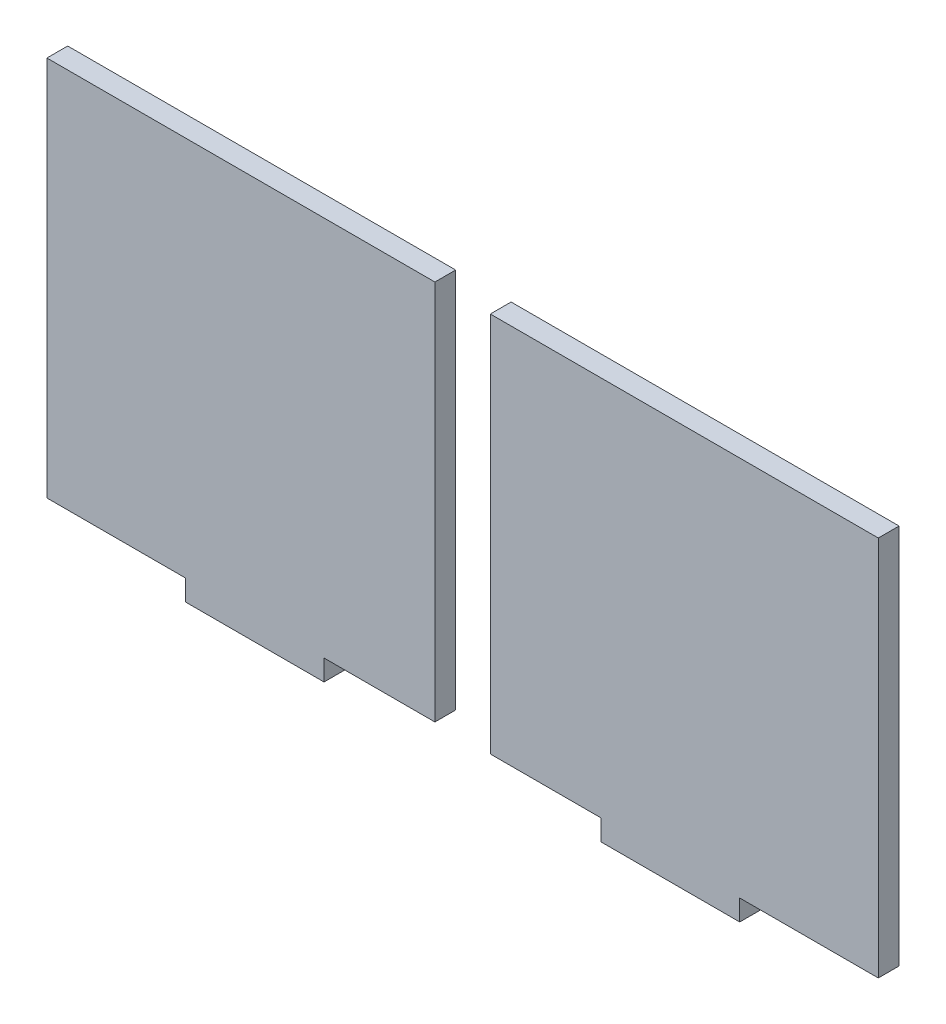
ISO-10303-21;
HEADER;
FILE_DESCRIPTION(('STEP AP214'),'2;1');
FILE_NAME('part.step','',(''),(''),'','','');
FILE_SCHEMA(('AUTOMOTIVE_DESIGN { 1 0 10303 214 1 1 1 1 }'));
ENDSEC;
DATA;
#1=APPLICATION_CONTEXT('core data for automotive mechanical design processes');
#2=APPLICATION_PROTOCOL_DEFINITION('international standard','automotive_design',2000,#1);
#3=PRODUCT_CONTEXT('',#1,'mechanical');
#4=PRODUCT('Part','Part','',(#3));
#5=PRODUCT_RELATED_PRODUCT_CATEGORY('part','',(#4));
#6=PRODUCT_DEFINITION_FORMATION('','',#4);
#7=PRODUCT_DEFINITION_CONTEXT('part definition',#1,'design');
#8=PRODUCT_DEFINITION('design','',#6,#7);
#9=PRODUCT_DEFINITION_SHAPE('','',#8);
#10=(LENGTH_UNIT() NAMED_UNIT(*) SI_UNIT(.MILLI.,.METRE.));
#11=(NAMED_UNIT(*) PLANE_ANGLE_UNIT() SI_UNIT($,.RADIAN.));
#12=(NAMED_UNIT(*) SI_UNIT($,.STERADIAN.) SOLID_ANGLE_UNIT());
#13=UNCERTAINTY_MEASURE_WITH_UNIT(LENGTH_MEASURE(1.E-05),#10,'distance_accuracy_value','');
#14=(GEOMETRIC_REPRESENTATION_CONTEXT(3) GLOBAL_UNCERTAINTY_ASSIGNED_CONTEXT((#13)) GLOBAL_UNIT_ASSIGNED_CONTEXT((#10,
#11,#12)) REPRESENTATION_CONTEXT('',''));
#15=CARTESIAN_POINT('',(0.,0.,0.));
#16=DIRECTION('',(0.,0.,1.));
#17=DIRECTION('',(1.,0.,0.));
#18=AXIS2_PLACEMENT_3D('',#15,#16,#17);
#19=CARTESIAN_POINT('',(120.,0.,-3.));
#20=DIRECTION('',(0.,-1.,0.));
#21=DIRECTION('',(1.,0.,0.));
#22=AXIS2_PLACEMENT_3D('',#19,#20,#21);
#23=PLANE('',#22);
#24=DIRECTION('',(1.,0.,0.));
#25=VECTOR('',#24,1.);
#26=CARTESIAN_POINT('',(120.,0.,-3.));
#27=LINE('',#26,#25);
#28=CARTESIAN_POINT('',(64.,0.,-3.));
#29=VERTEX_POINT('',#28);
#30=CARTESIAN_POINT('',(80.,0.,-3.));
#31=VERTEX_POINT('',#30);
#32=EDGE_CURVE('E162',#29,#31,#27,.T.);
#33=ORIENTED_EDGE('',*,*,#32,.T.);
#34=DIRECTION('',(0.,0.,1.));
#35=VECTOR('',#34,1.);
#36=CARTESIAN_POINT('',(80.,0.,-3.));
#37=LINE('',#36,#35);
#38=CARTESIAN_POINT('',(80.,0.,0.));
#39=VERTEX_POINT('',#38);
#40=EDGE_CURVE('E140',#31,#39,#37,.T.);
#41=ORIENTED_EDGE('',*,*,#40,.T.);
#42=DIRECTION('',(1.,0.,0.));
#43=VECTOR('',#42,1.);
#44=CARTESIAN_POINT('',(120.,0.,0.));
#45=LINE('',#44,#43);
#46=CARTESIAN_POINT('',(64.,0.,0.));
#47=VERTEX_POINT('',#46);
#48=EDGE_CURVE('E157',#47,#39,#45,.T.);
#49=ORIENTED_EDGE('',*,*,#48,.F.);
#50=DIRECTION('',(0.,0.,1.));
#51=VECTOR('',#50,1.);
#52=CARTESIAN_POINT('',(64.,0.,-3.));
#53=LINE('',#52,#51);
#54=EDGE_CURVE('E52',#29,#47,#53,.T.);
#55=ORIENTED_EDGE('',*,*,#54,.F.);
#56=EDGE_LOOP('',(#33,#41,#49,#55));
#57=FACE_BOUND('',#56,.T.);
#58=ADVANCED_FACE('F43',(#57),#23,.T.);
#59=CARTESIAN_POINT('',(120.,55.,-3.));
#60=DIRECTION('',(1.,0.,0.));
#61=DIRECTION('',(0.,0.,-1.));
#62=AXIS2_PLACEMENT_3D('',#59,#60,#61);
#63=PLANE('',#62);
#64=DIRECTION('',(0.,1.,0.));
#65=VECTOR('',#64,1.);
#66=CARTESIAN_POINT('',(120.,55.,0.));
#67=LINE('',#66,#65);
#68=CARTESIAN_POINT('',(120.,0.,0.));
#69=VERTEX_POINT('',#68);
#70=CARTESIAN_POINT('',(120.,55.,0.));
#71=VERTEX_POINT('',#70);
#72=EDGE_CURVE('E149',#69,#71,#67,.T.);
#73=ORIENTED_EDGE('',*,*,#72,.F.);
#74=DIRECTION('',(0.,0.,1.));
#75=VECTOR('',#74,1.);
#76=CARTESIAN_POINT('',(120.,0.,-3.));
#77=LINE('',#76,#75);
#78=CARTESIAN_POINT('',(120.,0.,-3.));
#79=VERTEX_POINT('',#78);
#80=EDGE_CURVE('E12',#79,#69,#77,.T.);
#81=ORIENTED_EDGE('',*,*,#80,.F.);
#82=DIRECTION('',(0.,1.,0.));
#83=VECTOR('',#82,1.);
#84=CARTESIAN_POINT('',(120.,55.,-3.));
#85=LINE('',#84,#83);
#86=CARTESIAN_POINT('',(120.,55.,-3.));
#87=VERTEX_POINT('',#86);
#88=EDGE_CURVE('E153',#79,#87,#85,.T.);
#89=ORIENTED_EDGE('',*,*,#88,.T.);
#90=DIRECTION('',(0.,0.,1.));
#91=VECTOR('',#90,1.);
#92=CARTESIAN_POINT('',(120.,55.,-3.));
#93=LINE('',#92,#91);
#94=EDGE_CURVE('E47',#87,#71,#93,.T.);
#95=ORIENTED_EDGE('',*,*,#94,.T.);
#96=EDGE_LOOP('',(#73,#81,#89,#95));
#97=FACE_BOUND('',#96,.T.);
#98=ADVANCED_FACE('F45',(#97),#63,.T.);
#99=DIRECTION('',(0.,0.,1.));
#100=VECTOR('',#99,1.);
#101=CARTESIAN_POINT('',(100.,0.,-3.));
#102=LINE('',#101,#100);
#103=CARTESIAN_POINT('',(100.,0.,-3.));
#104=VERTEX_POINT('',#103);
#105=CARTESIAN_POINT('',(100.,0.,0.));
#106=VERTEX_POINT('',#105);
#107=EDGE_CURVE('E150',#104,#106,#102,.T.);
#108=ORIENTED_EDGE('',*,*,#107,.F.);
#109=EDGE_CURVE('E68',#104,#79,#27,.T.);
#110=ORIENTED_EDGE('',*,*,#109,.T.);
#111=ORIENTED_EDGE('',*,*,#80,.T.);
#112=EDGE_CURVE('E91',#106,#69,#45,.T.);
#113=ORIENTED_EDGE('',*,*,#112,.F.);
#114=EDGE_LOOP('',(#108,#110,#111,#113));
#115=FACE_BOUND('',#114,.T.);
#116=ADVANCED_FACE('F191',(#115),#23,.T.);
#117=CARTESIAN_POINT('',(64.,55.,-3.));
#118=DIRECTION('',(-1.,0.,0.));
#119=DIRECTION('',(0.,0.,1.));
#120=AXIS2_PLACEMENT_3D('',#117,#118,#119);
#121=PLANE('',#120);
#122=DIRECTION('',(0.,-1.,0.));
#123=VECTOR('',#122,1.);
#124=CARTESIAN_POINT('',(64.,55.,0.));
#125=LINE('',#124,#123);
#126=CARTESIAN_POINT('',(64.,55.,0.));
#127=VERTEX_POINT('',#126);
#128=EDGE_CURVE('E168',#127,#47,#125,.T.);
#129=ORIENTED_EDGE('',*,*,#128,.F.);
#130=DIRECTION('',(0.,0.,1.));
#131=VECTOR('',#130,1.);
#132=CARTESIAN_POINT('',(64.,55.,-3.));
#133=LINE('',#132,#131);
#134=CARTESIAN_POINT('',(64.,55.,-3.));
#135=VERTEX_POINT('',#134);
#136=EDGE_CURVE('E173',#135,#127,#133,.T.);
#137=ORIENTED_EDGE('',*,*,#136,.F.);
#138=DIRECTION('',(0.,-1.,0.));
#139=VECTOR('',#138,1.);
#140=CARTESIAN_POINT('',(64.,55.,-3.));
#141=LINE('',#140,#139);
#142=EDGE_CURVE('E159',#135,#29,#141,.T.);
#143=ORIENTED_EDGE('',*,*,#142,.T.);
#144=ORIENTED_EDGE('',*,*,#54,.T.);
#145=EDGE_LOOP('',(#129,#137,#143,#144));
#146=FACE_BOUND('',#145,.T.);
#147=ADVANCED_FACE('F198',(#146),#121,.T.);
#148=CARTESIAN_POINT('',(120.,55.,-3.));
#149=DIRECTION('',(0.,1.,0.));
#150=DIRECTION('',(-1.,0.,0.));
#151=AXIS2_PLACEMENT_3D('',#148,#149,#150);
#152=PLANE('',#151);
#153=DIRECTION('',(-1.,0.,0.));
#154=VECTOR('',#153,1.);
#155=CARTESIAN_POINT('',(120.,55.,0.));
#156=LINE('',#155,#154);
#157=EDGE_CURVE('E165',#71,#127,#156,.T.);
#158=ORIENTED_EDGE('',*,*,#157,.F.);
#159=ORIENTED_EDGE('',*,*,#94,.F.);
#160=DIRECTION('',(-1.,0.,0.));
#161=VECTOR('',#160,1.);
#162=CARTESIAN_POINT('',(120.,55.,-3.));
#163=LINE('',#162,#161);
#164=EDGE_CURVE('E156',#87,#135,#163,.T.);
#165=ORIENTED_EDGE('',*,*,#164,.T.);
#166=ORIENTED_EDGE('',*,*,#136,.T.);
#167=EDGE_LOOP('',(#158,#159,#165,#166));
#168=FACE_BOUND('',#167,.T.);
#169=ADVANCED_FACE('F177',(#168),#152,.T.);
#170=CARTESIAN_POINT('',(0.,0.,-3.));
#171=DIRECTION('',(0.,0.,-1.));
#172=DIRECTION('',(-1.,0.,0.));
#173=AXIS2_PLACEMENT_3D('',#170,#171,#172);
#174=PLANE('',#173);
#175=ORIENTED_EDGE('',*,*,#88,.F.);
#176=ORIENTED_EDGE('',*,*,#109,.F.);
#177=DIRECTION('',(0.,1.,0.));
#178=VECTOR('',#177,1.);
#179=CARTESIAN_POINT('',(100.,0.,-3.));
#180=LINE('',#179,#178);
#181=CARTESIAN_POINT('',(100.,-3.00000000000001,-3.));
#182=VERTEX_POINT('',#181);
#183=EDGE_CURVE('E128',#182,#104,#180,.T.);
#184=ORIENTED_EDGE('',*,*,#183,.F.);
#185=DIRECTION('',(1.,0.,0.));
#186=VECTOR('',#185,1.);
#187=CARTESIAN_POINT('',(80.,-3.00000000000001,-3.));
#188=LINE('',#187,#186);
#189=CARTESIAN_POINT('',(80.,-3.00000000000001,-3.));
#190=VERTEX_POINT('',#189);
#191=EDGE_CURVE('E123',#190,#182,#188,.T.);
#192=ORIENTED_EDGE('',*,*,#191,.F.);
#193=DIRECTION('',(0.,-1.,0.));
#194=VECTOR('',#193,1.);
#195=CARTESIAN_POINT('',(80.,0.,-3.));
#196=LINE('',#195,#194);
#197=EDGE_CURVE('E136',#31,#190,#196,.T.);
#198=ORIENTED_EDGE('',*,*,#197,.F.);
#199=ORIENTED_EDGE('',*,*,#32,.F.);
#200=ORIENTED_EDGE('',*,*,#142,.F.);
#201=ORIENTED_EDGE('',*,*,#164,.F.);
#202=EDGE_LOOP('',(#175,#176,#184,#192,#198,#199,#200,#201));
#203=FACE_BOUND('',#202,.T.);
#204=ADVANCED_FACE('F134',(#203),#174,.T.);
#205=CARTESIAN_POINT('',(0.,0.,0.));
#206=DIRECTION('',(0.,0.,-1.));
#207=DIRECTION('',(-1.,0.,0.));
#208=AXIS2_PLACEMENT_3D('',#205,#206,#207);
#209=PLANE('',#208);
#210=ORIENTED_EDGE('',*,*,#72,.T.);
#211=ORIENTED_EDGE('',*,*,#157,.T.);
#212=ORIENTED_EDGE('',*,*,#128,.T.);
#213=ORIENTED_EDGE('',*,*,#48,.T.);
#214=DIRECTION('',(0.,-1.,0.));
#215=VECTOR('',#214,1.);
#216=CARTESIAN_POINT('',(80.,0.,0.));
#217=LINE('',#216,#215);
#218=CARTESIAN_POINT('',(80.,-3.00000000000001,0.));
#219=VERTEX_POINT('',#218);
#220=EDGE_CURVE('E60',#39,#219,#217,.T.);
#221=ORIENTED_EDGE('',*,*,#220,.T.);
#222=DIRECTION('',(1.,0.,0.));
#223=VECTOR('',#222,1.);
#224=CARTESIAN_POINT('',(80.,-3.00000000000001,0.));
#225=LINE('',#224,#223);
#226=CARTESIAN_POINT('',(100.,-3.00000000000001,0.));
#227=VERTEX_POINT('',#226);
#228=EDGE_CURVE('E125',#219,#227,#225,.T.);
#229=ORIENTED_EDGE('',*,*,#228,.T.);
#230=DIRECTION('',(0.,1.,0.));
#231=VECTOR('',#230,1.);
#232=CARTESIAN_POINT('',(100.,0.,0.));
#233=LINE('',#232,#231);
#234=EDGE_CURVE('E141',#227,#106,#233,.T.);
#235=ORIENTED_EDGE('',*,*,#234,.T.);
#236=ORIENTED_EDGE('',*,*,#112,.T.);
#237=EDGE_LOOP('',(#210,#211,#212,#213,#221,#229,#235,#236));
#238=FACE_BOUND('',#237,.T.);
#239=ADVANCED_FACE('F178',(#238),#209,.F.);
#240=CARTESIAN_POINT('',(80.,0.,-3.));
#241=DIRECTION('',(-1.,0.,0.));
#242=DIRECTION('',(0.,0.,1.));
#243=AXIS2_PLACEMENT_3D('',#240,#241,#242);
#244=PLANE('',#243);
#245=ORIENTED_EDGE('',*,*,#220,.F.);
#246=ORIENTED_EDGE('',*,*,#40,.F.);
#247=ORIENTED_EDGE('',*,*,#197,.T.);
#248=DIRECTION('',(0.,0.,1.));
#249=VECTOR('',#248,1.);
#250=CARTESIAN_POINT('',(80.,-3.00000000000001,-3.));
#251=LINE('',#250,#249);
#252=EDGE_CURVE('E120',#190,#219,#251,.T.);
#253=ORIENTED_EDGE('',*,*,#252,.T.);
#254=EDGE_LOOP('',(#245,#246,#247,#253));
#255=FACE_BOUND('',#254,.T.);
#256=ADVANCED_FACE('F139',(#255),#244,.T.);
#257=CARTESIAN_POINT('',(100.,0.,-3.));
#258=DIRECTION('',(1.,0.,0.));
#259=DIRECTION('',(0.,0.,-1.));
#260=AXIS2_PLACEMENT_3D('',#257,#258,#259);
#261=PLANE('',#260);
#262=ORIENTED_EDGE('',*,*,#234,.F.);
#263=DIRECTION('',(0.,0.,1.));
#264=VECTOR('',#263,1.);
#265=CARTESIAN_POINT('',(100.,-3.00000000000001,-3.));
#266=LINE('',#265,#264);
#267=EDGE_CURVE('E127',#182,#227,#266,.T.);
#268=ORIENTED_EDGE('',*,*,#267,.F.);
#269=ORIENTED_EDGE('',*,*,#183,.T.);
#270=ORIENTED_EDGE('',*,*,#107,.T.);
#271=EDGE_LOOP('',(#262,#268,#269,#270));
#272=FACE_BOUND('',#271,.T.);
#273=ADVANCED_FACE('F185',(#272),#261,.T.);
#274=CARTESIAN_POINT('',(80.,-3.00000000000001,-3.));
#275=DIRECTION('',(0.,-1.,0.));
#276=DIRECTION('',(0.,0.,-1.));
#277=AXIS2_PLACEMENT_3D('',#274,#275,#276);
#278=PLANE('',#277);
#279=ORIENTED_EDGE('',*,*,#228,.F.);
#280=ORIENTED_EDGE('',*,*,#252,.F.);
#281=ORIENTED_EDGE('',*,*,#191,.T.);
#282=ORIENTED_EDGE('',*,*,#267,.T.);
#283=EDGE_LOOP('',(#279,#280,#281,#282));
#284=FACE_BOUND('',#283,.T.);
#285=ADVANCED_FACE('F122',(#284),#278,.T.);
#286=CLOSED_SHELL('',(#58,#98,#116,#147,#169,#204,#239,#256,#273,#285));
#287=MANIFOLD_SOLID_BREP('B2',#286);
#288=CARTESIAN_POINT('',(0.,0.,-3.));
#289=DIRECTION('',(0.,-1.,0.));
#290=DIRECTION('',(0.,0.,-1.));
#291=AXIS2_PLACEMENT_3D('',#288,#289,#290);
#292=PLANE('',#291);
#293=DIRECTION('',(1.,0.,0.));
#294=VECTOR('',#293,1.);
#295=CARTESIAN_POINT('',(0.,0.,-3.));
#296=LINE('',#295,#294);
#297=CARTESIAN_POINT('',(0.,0.,-3.));
#298=VERTEX_POINT('',#297);
#299=CARTESIAN_POINT('',(20.,0.,-3.));
#300=VERTEX_POINT('',#299);
#301=EDGE_CURVE('E383',#298,#300,#296,.T.);
#302=ORIENTED_EDGE('',*,*,#301,.T.);
#303=DIRECTION('',(0.,0.,1.));
#304=VECTOR('',#303,1.);
#305=CARTESIAN_POINT('',(20.,0.,-3.));
#306=LINE('',#305,#304);
#307=CARTESIAN_POINT('',(20.,0.,0.));
#308=VERTEX_POINT('',#307);
#309=EDGE_CURVE('E365',#300,#308,#306,.T.);
#310=ORIENTED_EDGE('',*,*,#309,.T.);
#311=DIRECTION('',(1.,0.,0.));
#312=VECTOR('',#311,1.);
#313=CARTESIAN_POINT('',(0.,0.,0.));
#314=LINE('',#313,#312);
#315=CARTESIAN_POINT('',(0.,0.,0.));
#316=VERTEX_POINT('',#315);
#317=EDGE_CURVE('E393',#316,#308,#314,.T.);
#318=ORIENTED_EDGE('',*,*,#317,.F.);
#319=DIRECTION('',(0.,0.,1.));
#320=VECTOR('',#319,1.);
#321=CARTESIAN_POINT('',(0.,0.,-3.));
#322=LINE('',#321,#320);
#323=EDGE_CURVE('E278',#298,#316,#322,.T.);
#324=ORIENTED_EDGE('',*,*,#323,.F.);
#325=EDGE_LOOP('',(#302,#310,#318,#324));
#326=FACE_BOUND('',#325,.T.);
#327=ADVANCED_FACE('F274',(#326),#292,.T.);
#328=CARTESIAN_POINT('',(0.,0.,-3.));
#329=DIRECTION('',(-1.,0.,0.));
#330=DIRECTION('',(0.,0.,1.));
#331=AXIS2_PLACEMENT_3D('',#328,#329,#330);
#332=PLANE('',#331);
#333=DIRECTION('',(0.,-1.,0.));
#334=VECTOR('',#333,1.);
#335=CARTESIAN_POINT('',(0.,0.,0.));
#336=LINE('',#335,#334);
#337=CARTESIAN_POINT('',(0.,55.,0.));
#338=VERTEX_POINT('',#337);
#339=EDGE_CURVE('E375',#338,#316,#336,.T.);
#340=ORIENTED_EDGE('',*,*,#339,.F.);
#341=DIRECTION('',(0.,0.,1.));
#342=VECTOR('',#341,1.);
#343=CARTESIAN_POINT('',(0.,55.,-3.));
#344=LINE('',#343,#342);
#345=CARTESIAN_POINT('',(0.,55.,-3.));
#346=VERTEX_POINT('',#345);
#347=EDGE_CURVE('E41',#346,#338,#344,.T.);
#348=ORIENTED_EDGE('',*,*,#347,.F.);
#349=DIRECTION('',(0.,-1.,0.));
#350=VECTOR('',#349,1.);
#351=CARTESIAN_POINT('',(0.,0.,-3.));
#352=LINE('',#351,#350);
#353=EDGE_CURVE('E379',#346,#298,#352,.T.);
#354=ORIENTED_EDGE('',*,*,#353,.T.);
#355=ORIENTED_EDGE('',*,*,#323,.T.);
#356=EDGE_LOOP('',(#340,#348,#354,#355));
#357=FACE_BOUND('',#356,.T.);
#358=ADVANCED_FACE('F276',(#357),#332,.T.);
#359=CARTESIAN_POINT('',(0.,55.,-3.));
#360=DIRECTION('',(0.,1.,0.));
#361=DIRECTION('',(-1.,0.,0.));
#362=AXIS2_PLACEMENT_3D('',#359,#360,#361);
#363=PLANE('',#362);
#364=DIRECTION('',(-1.,0.,0.));
#365=VECTOR('',#364,1.);
#366=CARTESIAN_POINT('',(0.,55.,0.));
#367=LINE('',#366,#365);
#368=CARTESIAN_POINT('',(56.,55.,0.));
#369=VERTEX_POINT('',#368);
#370=EDGE_CURVE('E382',#369,#338,#367,.T.);
#371=ORIENTED_EDGE('',*,*,#370,.F.);
#372=DIRECTION('',(0.,0.,1.));
#373=VECTOR('',#372,1.);
#374=CARTESIAN_POINT('',(56.,55.,-3.));
#375=LINE('',#374,#373);
#376=CARTESIAN_POINT('',(56.,55.,-3.));
#377=VERTEX_POINT('',#376);
#378=EDGE_CURVE('E283',#377,#369,#375,.T.);
#379=ORIENTED_EDGE('',*,*,#378,.F.);
#380=DIRECTION('',(-1.,0.,0.));
#381=VECTOR('',#380,1.);
#382=CARTESIAN_POINT('',(0.,55.,-3.));
#383=LINE('',#382,#381);
#384=EDGE_CURVE('E388',#377,#346,#383,.T.);
#385=ORIENTED_EDGE('',*,*,#384,.T.);
#386=ORIENTED_EDGE('',*,*,#347,.T.);
#387=EDGE_LOOP('',(#371,#379,#385,#386));
#388=FACE_BOUND('',#387,.T.);
#389=ADVANCED_FACE('F409',(#388),#363,.T.);
#390=CARTESIAN_POINT('',(56.,0.,-3.));
#391=DIRECTION('',(1.,0.,0.));
#392=DIRECTION('',(0.,0.,-1.));
#393=AXIS2_PLACEMENT_3D('',#390,#391,#392);
#394=PLANE('',#393);
#395=DIRECTION('',(0.,1.,0.));
#396=VECTOR('',#395,1.);
#397=CARTESIAN_POINT('',(56.,0.,0.));
#398=LINE('',#397,#396);
#399=CARTESIAN_POINT('',(56.,0.,0.));
#400=VERTEX_POINT('',#399);
#401=EDGE_CURVE('E396',#400,#369,#398,.T.);
#402=ORIENTED_EDGE('',*,*,#401,.F.);
#403=DIRECTION('',(0.,0.,1.));
#404=VECTOR('',#403,1.);
#405=CARTESIAN_POINT('',(56.,0.,-3.));
#406=LINE('',#405,#404);
#407=CARTESIAN_POINT('',(56.,0.,-3.));
#408=VERTEX_POINT('',#407);
#409=EDGE_CURVE('E401',#408,#400,#406,.T.);
#410=ORIENTED_EDGE('',*,*,#409,.F.);
#411=DIRECTION('',(0.,1.,0.));
#412=VECTOR('',#411,1.);
#413=CARTESIAN_POINT('',(56.,0.,-3.));
#414=LINE('',#413,#412);
#415=EDGE_CURVE('E385',#408,#377,#414,.T.);
#416=ORIENTED_EDGE('',*,*,#415,.T.);
#417=ORIENTED_EDGE('',*,*,#378,.T.);
#418=EDGE_LOOP('',(#402,#410,#416,#417));
#419=FACE_BOUND('',#418,.T.);
#420=ADVANCED_FACE('F413',(#419),#394,.T.);
#421=DIRECTION('',(0.,0.,1.));
#422=VECTOR('',#421,1.);
#423=CARTESIAN_POINT('',(40.,0.,-3.));
#424=LINE('',#423,#422);
#425=CARTESIAN_POINT('',(40.,0.,-3.));
#426=VERTEX_POINT('',#425);
#427=CARTESIAN_POINT('',(40.,0.,0.));
#428=VERTEX_POINT('',#427);
#429=EDGE_CURVE('E376',#426,#428,#424,.T.);
#430=ORIENTED_EDGE('',*,*,#429,.F.);
#431=EDGE_CURVE('E381',#426,#408,#296,.T.);
#432=ORIENTED_EDGE('',*,*,#431,.T.);
#433=ORIENTED_EDGE('',*,*,#409,.T.);
#434=EDGE_CURVE('E392',#428,#400,#314,.T.);
#435=ORIENTED_EDGE('',*,*,#434,.F.);
#436=EDGE_LOOP('',(#430,#432,#433,#435));
#437=FACE_BOUND('',#436,.T.);
#438=ADVANCED_FACE('F415',(#437),#292,.T.);
#439=CARTESIAN_POINT('',(0.,0.,-3.));
#440=DIRECTION('',(0.,0.,-1.));
#441=DIRECTION('',(-1.,0.,0.));
#442=AXIS2_PLACEMENT_3D('',#439,#440,#441);
#443=PLANE('',#442);
#444=ORIENTED_EDGE('',*,*,#353,.F.);
#445=ORIENTED_EDGE('',*,*,#384,.F.);
#446=ORIENTED_EDGE('',*,*,#415,.F.);
#447=ORIENTED_EDGE('',*,*,#431,.F.);
#448=DIRECTION('',(0.,1.,0.));
#449=VECTOR('',#448,1.);
#450=CARTESIAN_POINT('',(40.,0.,-3.));
#451=LINE('',#450,#449);
#452=CARTESIAN_POINT('',(40.,-3.,-3.));
#453=VERTEX_POINT('',#452);
#454=EDGE_CURVE('E355',#453,#426,#451,.T.);
#455=ORIENTED_EDGE('',*,*,#454,.F.);
#456=DIRECTION('',(1.,0.,0.));
#457=VECTOR('',#456,1.);
#458=CARTESIAN_POINT('',(20.,-3.,-3.));
#459=LINE('',#458,#457);
#460=CARTESIAN_POINT('',(20.,-3.,-3.));
#461=VERTEX_POINT('',#460);
#462=EDGE_CURVE('E350',#461,#453,#459,.T.);
#463=ORIENTED_EDGE('',*,*,#462,.F.);
#464=DIRECTION('',(0.,-1.,0.));
#465=VECTOR('',#464,1.);
#466=CARTESIAN_POINT('',(20.,0.,-3.));
#467=LINE('',#466,#465);
#468=EDGE_CURVE('E361',#300,#461,#467,.T.);
#469=ORIENTED_EDGE('',*,*,#468,.F.);
#470=ORIENTED_EDGE('',*,*,#301,.F.);
#471=EDGE_LOOP('',(#444,#445,#446,#447,#455,#463,#469,#470));
#472=FACE_BOUND('',#471,.T.);
#473=ADVANCED_FACE('F360',(#472),#443,.T.);
#474=CARTESIAN_POINT('',(0.,0.,0.));
#475=DIRECTION('',(0.,0.,-1.));
#476=DIRECTION('',(-1.,0.,0.));
#477=AXIS2_PLACEMENT_3D('',#474,#475,#476);
#478=PLANE('',#477);
#479=ORIENTED_EDGE('',*,*,#339,.T.);
#480=ORIENTED_EDGE('',*,*,#317,.T.);
#481=DIRECTION('',(0.,-1.,0.));
#482=VECTOR('',#481,1.);
#483=CARTESIAN_POINT('',(20.,0.,0.));
#484=LINE('',#483,#482);
#485=CARTESIAN_POINT('',(20.,-3.,0.));
#486=VERTEX_POINT('',#485);
#487=EDGE_CURVE('E291',#308,#486,#484,.T.);
#488=ORIENTED_EDGE('',*,*,#487,.T.);
#489=DIRECTION('',(1.,0.,0.));
#490=VECTOR('',#489,1.);
#491=CARTESIAN_POINT('',(20.,-3.,0.));
#492=LINE('',#491,#490);
#493=CARTESIAN_POINT('',(40.,-3.,0.));
#494=VERTEX_POINT('',#493);
#495=EDGE_CURVE('E352',#486,#494,#492,.T.);
#496=ORIENTED_EDGE('',*,*,#495,.T.);
#497=DIRECTION('',(0.,1.,0.));
#498=VECTOR('',#497,1.);
#499=CARTESIAN_POINT('',(40.,0.,0.));
#500=LINE('',#499,#498);
#501=EDGE_CURVE('E366',#494,#428,#500,.T.);
#502=ORIENTED_EDGE('',*,*,#501,.T.);
#503=ORIENTED_EDGE('',*,*,#434,.T.);
#504=ORIENTED_EDGE('',*,*,#401,.T.);
#505=ORIENTED_EDGE('',*,*,#370,.T.);
#506=EDGE_LOOP('',(#479,#480,#488,#496,#502,#503,#504,#505));
#507=FACE_BOUND('',#506,.T.);
#508=ADVANCED_FACE('F408',(#507),#478,.F.);
#509=CARTESIAN_POINT('',(20.,0.,-3.));
#510=DIRECTION('',(-1.,0.,0.));
#511=DIRECTION('',(0.,0.,1.));
#512=AXIS2_PLACEMENT_3D('',#509,#510,#511);
#513=PLANE('',#512);
#514=ORIENTED_EDGE('',*,*,#487,.F.);
#515=ORIENTED_EDGE('',*,*,#309,.F.);
#516=ORIENTED_EDGE('',*,*,#468,.T.);
#517=DIRECTION('',(0.,0.,1.));
#518=VECTOR('',#517,1.);
#519=CARTESIAN_POINT('',(20.,-3.,-3.));
#520=LINE('',#519,#518);
#521=EDGE_CURVE('E347',#461,#486,#520,.T.);
#522=ORIENTED_EDGE('',*,*,#521,.T.);
#523=EDGE_LOOP('',(#514,#515,#516,#522));
#524=FACE_BOUND('',#523,.T.);
#525=ADVANCED_FACE('F364',(#524),#513,.T.);
#526=CARTESIAN_POINT('',(40.,0.,-3.));
#527=DIRECTION('',(1.,0.,0.));
#528=DIRECTION('',(0.,1.,0.));
#529=AXIS2_PLACEMENT_3D('',#526,#527,#528);
#530=PLANE('',#529);
#531=ORIENTED_EDGE('',*,*,#501,.F.);
#532=DIRECTION('',(0.,0.,1.));
#533=VECTOR('',#532,1.);
#534=CARTESIAN_POINT('',(40.,-3.,-3.));
#535=LINE('',#534,#533);
#536=EDGE_CURVE('E354',#453,#494,#535,.T.);
#537=ORIENTED_EDGE('',*,*,#536,.F.);
#538=ORIENTED_EDGE('',*,*,#454,.T.);
#539=ORIENTED_EDGE('',*,*,#429,.T.);
#540=EDGE_LOOP('',(#531,#537,#538,#539));
#541=FACE_BOUND('',#540,.T.);
#542=ADVANCED_FACE('F418',(#541),#530,.T.);
#543=CARTESIAN_POINT('',(20.,-3.,-3.));
#544=DIRECTION('',(0.,-1.,0.));
#545=DIRECTION('',(0.,0.,-1.));
#546=AXIS2_PLACEMENT_3D('',#543,#544,#545);
#547=PLANE('',#546);
#548=ORIENTED_EDGE('',*,*,#495,.F.);
#549=ORIENTED_EDGE('',*,*,#521,.F.);
#550=ORIENTED_EDGE('',*,*,#462,.T.);
#551=ORIENTED_EDGE('',*,*,#536,.T.);
#552=EDGE_LOOP('',(#548,#549,#550,#551));
#553=FACE_BOUND('',#552,.T.);
#554=ADVANCED_FACE('F349',(#553),#547,.T.);
#555=CLOSED_SHELL('',(#327,#358,#389,#420,#438,#473,#508,#525,#542,#554));
#556=MANIFOLD_SOLID_BREP('B6',#555);
#557=ADVANCED_BREP_SHAPE_REPRESENTATION('',(#18,#287,#556),#14);
#558=SHAPE_DEFINITION_REPRESENTATION(#9,#557);
ENDSEC;
END-ISO-10303-21;
